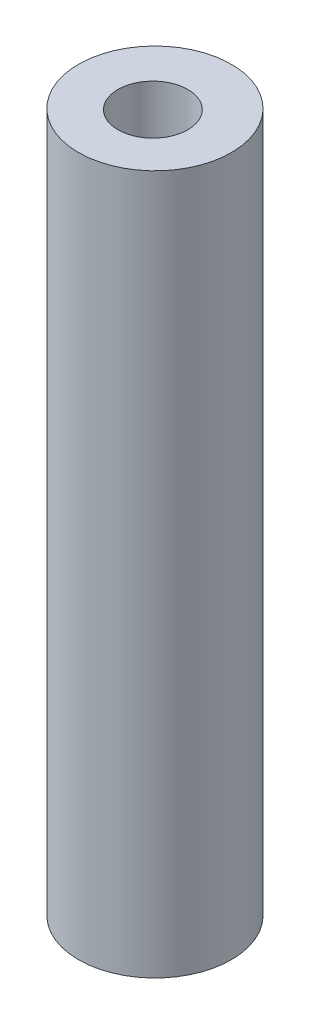
ISO-10303-21;
HEADER;
FILE_DESCRIPTION(('STEP AP214'),'2;1');
FILE_NAME('part.step','',(''),(''),'','','');
FILE_SCHEMA(('AUTOMOTIVE_DESIGN { 1 0 10303 214 1 1 1 1 }'));
ENDSEC;
DATA;
#1=APPLICATION_CONTEXT('core data for automotive mechanical design processes');
#2=APPLICATION_PROTOCOL_DEFINITION('international standard','automotive_design',2000,#1);
#3=PRODUCT_CONTEXT('',#1,'mechanical');
#4=PRODUCT('Part','Part','',(#3));
#5=PRODUCT_RELATED_PRODUCT_CATEGORY('part','',(#4));
#6=PRODUCT_DEFINITION_FORMATION('','',#4);
#7=PRODUCT_DEFINITION_CONTEXT('part definition',#1,'design');
#8=PRODUCT_DEFINITION('design','',#6,#7);
#9=PRODUCT_DEFINITION_SHAPE('','',#8);
#10=(LENGTH_UNIT() NAMED_UNIT(*) SI_UNIT(.MILLI.,.METRE.));
#11=(NAMED_UNIT(*) PLANE_ANGLE_UNIT() SI_UNIT($,.RADIAN.));
#12=(NAMED_UNIT(*) SI_UNIT($,.STERADIAN.) SOLID_ANGLE_UNIT());
#13=UNCERTAINTY_MEASURE_WITH_UNIT(LENGTH_MEASURE(1.E-05),#10,'distance_accuracy_value','');
#14=(GEOMETRIC_REPRESENTATION_CONTEXT(3) GLOBAL_UNCERTAINTY_ASSIGNED_CONTEXT((#13)) GLOBAL_UNIT_ASSIGNED_CONTEXT((#10,
#11,#12)) REPRESENTATION_CONTEXT('',''));
#15=CARTESIAN_POINT('',(0.,0.,0.));
#16=DIRECTION('',(0.,0.,1.));
#17=DIRECTION('',(1.,0.,0.));
#18=AXIS2_PLACEMENT_3D('',#15,#16,#17);
#19=CARTESIAN_POINT('',(0.,32.,0.));
#20=DIRECTION('',(0.,1.,0.));
#21=DIRECTION('',(0.,0.,1.));
#22=AXIS2_PLACEMENT_3D('',#19,#20,#21);
#23=PLANE('',#22);
#24=CARTESIAN_POINT('',(0.,32.,0.));
#25=DIRECTION('',(0.,1.,0.));
#26=DIRECTION('',(0.,0.,1.));
#27=AXIS2_PLACEMENT_3D('',#24,#25,#26);
#28=CIRCLE('',#27,3.5);
#29=CARTESIAN_POINT('',(0.,32.,3.5));
#30=VERTEX_POINT('',#29);
#31=EDGE_CURVE('E10',#30,#30,#28,.T.);
#32=ORIENTED_EDGE('',*,*,#31,.T.);
#33=EDGE_LOOP('',(#32));
#34=FACE_BOUND('',#33,.T.);
#35=CARTESIAN_POINT('',(0.,32.,0.0950731216757018));
#36=DIRECTION('',(0.,1.,0.));
#37=DIRECTION('',(0.,0.,1.));
#38=AXIS2_PLACEMENT_3D('',#35,#36,#37);
#39=CIRCLE('',#38,1.6);
#40=CARTESIAN_POINT('',(0.,32.,1.6950731216757));
#41=VERTEX_POINT('',#40);
#42=EDGE_CURVE('E48',#41,#41,#39,.T.);
#43=ORIENTED_EDGE('',*,*,#42,.F.);
#44=EDGE_LOOP('',(#43));
#45=FACE_BOUND('',#44,.T.);
#46=ADVANCED_FACE('F40',(#34,#45),#23,.T.);
#47=CARTESIAN_POINT('',(0.,0.,0.));
#48=DIRECTION('',(0.,1.,0.));
#49=DIRECTION('',(0.,0.,1.));
#50=AXIS2_PLACEMENT_3D('',#47,#48,#49);
#51=PLANE('',#50);
#52=CARTESIAN_POINT('',(0.,0.,0.));
#53=DIRECTION('',(0.,1.,0.));
#54=DIRECTION('',(0.,0.,1.));
#55=AXIS2_PLACEMENT_3D('',#52,#53,#54);
#56=CIRCLE('',#55,3.5);
#57=CARTESIAN_POINT('',(0.,0.,3.5));
#58=VERTEX_POINT('',#57);
#59=EDGE_CURVE('E41',#58,#58,#56,.T.);
#60=ORIENTED_EDGE('',*,*,#59,.F.);
#61=EDGE_LOOP('',(#60));
#62=FACE_BOUND('',#61,.T.);
#63=CARTESIAN_POINT('',(0.,0.,0.0950731216757018));
#64=DIRECTION('',(0.,1.,0.));
#65=DIRECTION('',(0.,0.,1.));
#66=AXIS2_PLACEMENT_3D('',#63,#64,#65);
#67=CIRCLE('',#66,1.6);
#68=CARTESIAN_POINT('',(0.,0.,1.6950731216757));
#69=VERTEX_POINT('',#68);
#70=EDGE_CURVE('E49',#69,#69,#67,.T.);
#71=ORIENTED_EDGE('',*,*,#70,.T.);
#72=EDGE_LOOP('',(#71));
#73=FACE_BOUND('',#72,.T.);
#74=ADVANCED_FACE('F58',(#62,#73),#51,.F.);
#75=CARTESIAN_POINT('',(0.,32.,0.));
#76=DIRECTION('',(0.,-1.,0.));
#77=DIRECTION('',(0.,0.,-1.));
#78=AXIS2_PLACEMENT_3D('',#75,#76,#77);
#79=CYLINDRICAL_SURFACE('',#78,3.5);
#80=ORIENTED_EDGE('',*,*,#31,.F.);
#81=EDGE_LOOP('',(#80));
#82=FACE_BOUND('',#81,.T.);
#83=ORIENTED_EDGE('',*,*,#59,.T.);
#84=EDGE_LOOP('',(#83));
#85=FACE_BOUND('',#84,.T.);
#86=ADVANCED_FACE('F39',(#82,#85),#79,.T.);
#87=CARTESIAN_POINT('',(0.,32.,0.0950731216757018));
#88=DIRECTION('',(0.,-1.,0.));
#89=DIRECTION('',(0.,0.,-1.));
#90=AXIS2_PLACEMENT_3D('',#87,#88,#89);
#91=CYLINDRICAL_SURFACE('',#90,1.6);
#92=ORIENTED_EDGE('',*,*,#42,.T.);
#93=EDGE_LOOP('',(#92));
#94=FACE_BOUND('',#93,.T.);
#95=ORIENTED_EDGE('',*,*,#70,.F.);
#96=EDGE_LOOP('',(#95));
#97=FACE_BOUND('',#96,.T.);
#98=ADVANCED_FACE('F57',(#94,#97),#91,.F.);
#99=CLOSED_SHELL('',(#46,#74,#86,#98));
#100=MANIFOLD_SOLID_BREP('B2',#99);
#101=ADVANCED_BREP_SHAPE_REPRESENTATION('',(#18,#100),#14);
#102=SHAPE_DEFINITION_REPRESENTATION(#9,#101);
ENDSEC;
END-ISO-10303-21;
